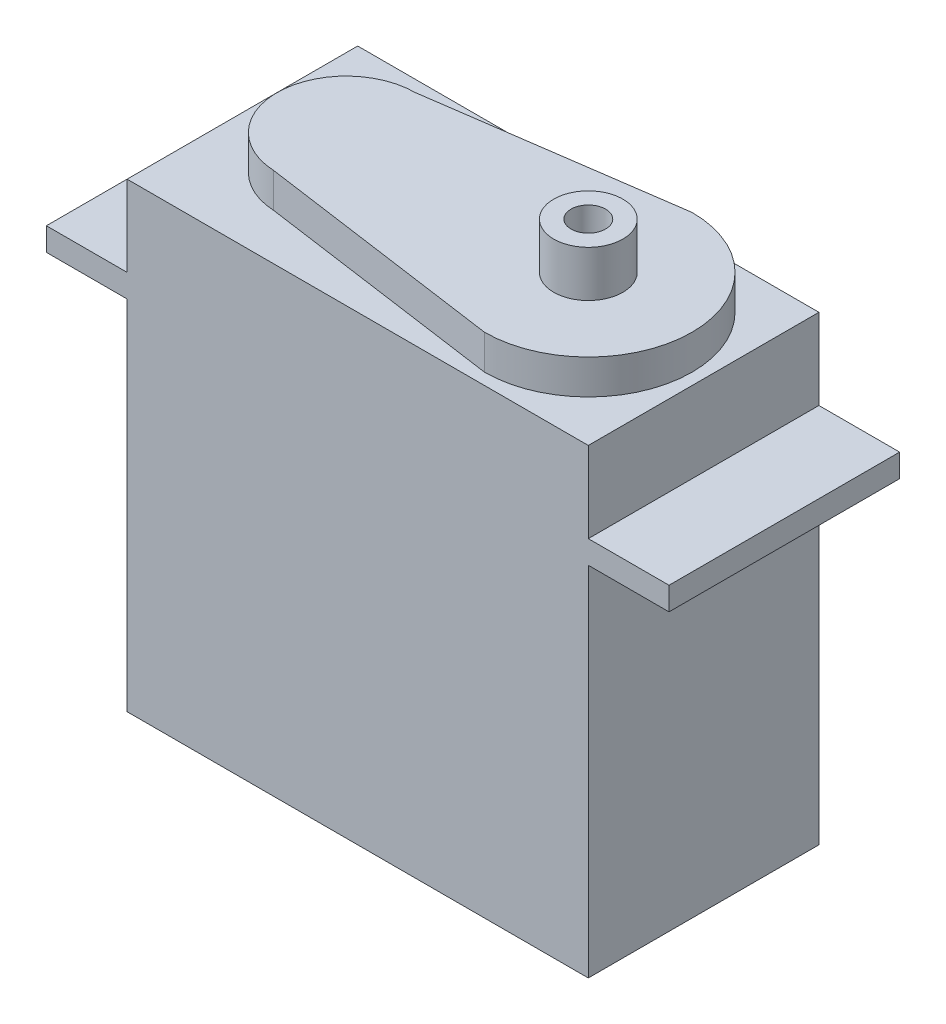
ISO-10303-21;
HEADER;
FILE_DESCRIPTION(('STEP AP214'),'2;1');
FILE_NAME('part.step','',(''),(''),'','','');
FILE_SCHEMA(('AUTOMOTIVE_DESIGN { 1 0 10303 214 1 1 1 1 }'));
ENDSEC;
DATA;
#1=APPLICATION_CONTEXT('core data for automotive mechanical design processes');
#2=APPLICATION_PROTOCOL_DEFINITION('international standard','automotive_design',2000,#1);
#3=PRODUCT_CONTEXT('',#1,'mechanical');
#4=PRODUCT('Part','Part','',(#3));
#5=PRODUCT_RELATED_PRODUCT_CATEGORY('part','',(#4));
#6=PRODUCT_DEFINITION_FORMATION('','',#4);
#7=PRODUCT_DEFINITION_CONTEXT('part definition',#1,'design');
#8=PRODUCT_DEFINITION('design','',#6,#7);
#9=PRODUCT_DEFINITION_SHAPE('','',#8);
#10=(LENGTH_UNIT() NAMED_UNIT(*) SI_UNIT(.MILLI.,.METRE.));
#11=(NAMED_UNIT(*) PLANE_ANGLE_UNIT() SI_UNIT($,.RADIAN.));
#12=(NAMED_UNIT(*) SI_UNIT($,.STERADIAN.) SOLID_ANGLE_UNIT());
#13=UNCERTAINTY_MEASURE_WITH_UNIT(LENGTH_MEASURE(1.E-05),#10,'distance_accuracy_value','');
#14=(GEOMETRIC_REPRESENTATION_CONTEXT(3) GLOBAL_UNCERTAINTY_ASSIGNED_CONTEXT((#13)) GLOBAL_UNIT_ASSIGNED_CONTEXT((#10,
#11,#12)) REPRESENTATION_CONTEXT('',''));
#15=CARTESIAN_POINT('',(0.,0.,0.));
#16=DIRECTION('',(0.,0.,1.));
#17=DIRECTION('',(1.,0.,0.));
#18=AXIS2_PLACEMENT_3D('',#15,#16,#17);
#19=CARTESIAN_POINT('',(-20.,20.,20.));
#20=DIRECTION('',(1.,0.,0.));
#21=DIRECTION('',(0.,1.,0.));
#22=AXIS2_PLACEMENT_3D('',#19,#20,#21);
#23=PLANE('',#22);
#24=DIRECTION('',(0.,0.,-1.));
#25=VECTOR('',#24,1.);
#26=CARTESIAN_POINT('',(-20.,13.,20.));
#27=LINE('',#26,#25);
#28=CARTESIAN_POINT('',(-20.,13.,20.));
#29=VERTEX_POINT('',#28);
#30=CARTESIAN_POINT('',(-20.,13.,0.));
#31=VERTEX_POINT('',#30);
#32=EDGE_CURVE('E267',#29,#31,#27,.T.);
#33=ORIENTED_EDGE('',*,*,#32,.F.);
#34=DIRECTION('',(0.,-1.,0.));
#35=VECTOR('',#34,1.);
#36=CARTESIAN_POINT('',(-20.,20.,20.));
#37=LINE('',#36,#35);
#38=CARTESIAN_POINT('',(-20.,20.,20.));
#39=VERTEX_POINT('',#38);
#40=EDGE_CURVE('E172',#39,#29,#37,.T.);
#41=ORIENTED_EDGE('',*,*,#40,.F.);
#42=DIRECTION('',(0.,0.,-1.));
#43=VECTOR('',#42,1.);
#44=CARTESIAN_POINT('',(-20.,20.,20.));
#45=LINE('',#44,#43);
#46=CARTESIAN_POINT('',(-20.,20.,0.));
#47=VERTEX_POINT('',#46);
#48=EDGE_CURVE('E204',#39,#47,#45,.T.);
#49=ORIENTED_EDGE('',*,*,#48,.T.);
#50=DIRECTION('',(0.,-1.,0.));
#51=VECTOR('',#50,1.);
#52=CARTESIAN_POINT('',(-20.,20.,0.));
#53=LINE('',#52,#51);
#54=EDGE_CURVE('E212',#47,#31,#53,.T.);
#55=ORIENTED_EDGE('',*,*,#54,.T.);
#56=EDGE_LOOP('',(#33,#41,#49,#55));
#57=FACE_BOUND('',#56,.T.);
#58=ADVANCED_FACE('F34',(#57),#23,.F.);
#59=CARTESIAN_POINT('',(20.,20.,20.));
#60=DIRECTION('',(-1.,0.,0.));
#61=DIRECTION('',(0.,-1.,0.));
#62=AXIS2_PLACEMENT_3D('',#59,#60,#61);
#63=PLANE('',#62);
#64=DIRECTION('',(0.,0.,-1.));
#65=VECTOR('',#64,1.);
#66=CARTESIAN_POINT('',(20.,11.,20.));
#67=LINE('',#66,#65);
#68=CARTESIAN_POINT('',(20.,11.,20.));
#69=VERTEX_POINT('',#68);
#70=CARTESIAN_POINT('',(20.,11.,0.));
#71=VERTEX_POINT('',#70);
#72=EDGE_CURVE('E232',#69,#71,#67,.T.);
#73=ORIENTED_EDGE('',*,*,#72,.F.);
#74=DIRECTION('',(0.,1.,0.));
#75=VECTOR('',#74,1.);
#76=CARTESIAN_POINT('',(20.,20.,20.));
#77=LINE('',#76,#75);
#78=CARTESIAN_POINT('',(20.,-20.,20.));
#79=VERTEX_POINT('',#78);
#80=EDGE_CURVE('E178',#79,#69,#77,.T.);
#81=ORIENTED_EDGE('',*,*,#80,.F.);
#82=DIRECTION('',(0.,0.,-1.));
#83=VECTOR('',#82,1.);
#84=CARTESIAN_POINT('',(20.,-20.,20.));
#85=LINE('',#84,#83);
#86=CARTESIAN_POINT('',(20.,-20.,0.));
#87=VERTEX_POINT('',#86);
#88=EDGE_CURVE('E189',#79,#87,#85,.T.);
#89=ORIENTED_EDGE('',*,*,#88,.T.);
#90=DIRECTION('',(0.,1.,0.));
#91=VECTOR('',#90,1.);
#92=CARTESIAN_POINT('',(20.,20.,0.));
#93=LINE('',#92,#91);
#94=EDGE_CURVE('E199',#87,#71,#93,.T.);
#95=ORIENTED_EDGE('',*,*,#94,.T.);
#96=EDGE_LOOP('',(#73,#81,#89,#95));
#97=FACE_BOUND('',#96,.T.);
#98=ADVANCED_FACE('F322',(#97),#63,.F.);
#99=CARTESIAN_POINT('',(9.99999999999999,23.,10.));
#100=DIRECTION('',(0.,1.,0.));
#101=DIRECTION('',(0.,0.,1.));
#102=AXIS2_PLACEMENT_3D('',#99,#100,#101);
#103=PLANE('',#102);
#104=CARTESIAN_POINT('',(9.99999999999999,23.,10.));
#105=DIRECTION('',(0.,1.,0.));
#106=DIRECTION('',(0.,0.,1.));
#107=AXIS2_PLACEMENT_3D('',#104,#105,#106);
#108=CIRCLE('',#107,9.);
#109=CARTESIAN_POINT('',(9.99999999999999,23.,19.));
#110=VERTEX_POINT('',#109);
#111=CARTESIAN_POINT('',(9.99999999999999,23.,1.));
#112=VERTEX_POINT('',#111);
#113=EDGE_CURVE('E407',#110,#112,#108,.T.);
#114=ORIENTED_EDGE('',*,*,#113,.T.);
#115=DIRECTION('',(-0.989949493661166,0.,0.141421356237309));
#116=VECTOR('',#115,1.);
#117=CARTESIAN_POINT('',(9.99999999999999,23.,1.));
#118=LINE('',#117,#116);
#119=CARTESIAN_POINT('',(-11.,23.,4.));
#120=VERTEX_POINT('',#119);
#121=EDGE_CURVE('E409',#112,#120,#118,.T.);
#122=ORIENTED_EDGE('',*,*,#121,.T.);
#123=CARTESIAN_POINT('',(-11.,23.,10.));
#124=DIRECTION('',(0.,1.,0.));
#125=DIRECTION('',(0.,0.,1.));
#126=AXIS2_PLACEMENT_3D('',#123,#124,#125);
#127=CIRCLE('',#126,6.);
#128=CARTESIAN_POINT('',(-11.2900500525208,23.,15.992985146572));
#129=VERTEX_POINT('',#128);
#130=EDGE_CURVE('E412',#120,#129,#127,.T.);
#131=ORIENTED_EDGE('',*,*,#130,.T.);
#132=DIRECTION('',(0.990172372254836,0.,0.139852326484868));
#133=VECTOR('',#132,1.);
#134=CARTESIAN_POINT('',(-11.2900500525208,23.,15.992985146572));
#135=LINE('',#134,#133);
#136=EDGE_CURVE('E414',#129,#110,#135,.T.);
#137=ORIENTED_EDGE('',*,*,#136,.T.);
#138=EDGE_LOOP('',(#114,#122,#131,#137));
#139=FACE_BOUND('',#138,.T.);
#140=CARTESIAN_POINT('',(9.99999999999999,23.,10.));
#141=DIRECTION('',(0.,1.,0.));
#142=DIRECTION('',(0.,0.,1.));
#143=AXIS2_PLACEMENT_3D('',#140,#141,#142);
#144=CIRCLE('',#143,3.);
#145=CARTESIAN_POINT('',(9.99999999999999,23.,13.));
#146=VERTEX_POINT('',#145);
#147=EDGE_CURVE('E400',#146,#146,#144,.T.);
#148=ORIENTED_EDGE('',*,*,#147,.F.);
#149=EDGE_LOOP('',(#148));
#150=FACE_BOUND('',#149,.T.);
#151=ADVANCED_FACE('F344',(#139,#150),#103,.T.);
#152=CARTESIAN_POINT('',(-20.,20.,20.));
#153=DIRECTION('',(0.,-1.,0.));
#154=DIRECTION('',(0.,0.,-1.));
#155=AXIS2_PLACEMENT_3D('',#152,#153,#154);
#156=PLANE('',#155);
#157=DIRECTION('',(-1.,0.,0.));
#158=VECTOR('',#157,1.);
#159=CARTESIAN_POINT('',(-20.,20.,0.));
#160=LINE('',#159,#158);
#161=CARTESIAN_POINT('',(20.,20.,0.));
#162=VERTEX_POINT('',#161);
#163=EDGE_CURVE('E192',#162,#47,#160,.T.);
#164=ORIENTED_EDGE('',*,*,#163,.T.);
#165=ORIENTED_EDGE('',*,*,#48,.F.);
#166=DIRECTION('',(-1.,0.,0.));
#167=VECTOR('',#166,1.);
#168=CARTESIAN_POINT('',(-20.,20.,20.));
#169=LINE('',#168,#167);
#170=CARTESIAN_POINT('',(20.,20.,20.));
#171=VERTEX_POINT('',#170);
#172=EDGE_CURVE('E173',#171,#39,#169,.T.);
#173=ORIENTED_EDGE('',*,*,#172,.F.);
#174=DIRECTION('',(0.,0.,-1.));
#175=VECTOR('',#174,1.);
#176=CARTESIAN_POINT('',(20.,20.,20.));
#177=LINE('',#176,#175);
#178=EDGE_CURVE('E43',#171,#162,#177,.T.);
#179=ORIENTED_EDGE('',*,*,#178,.T.);
#180=EDGE_LOOP('',(#164,#165,#173,#179));
#181=FACE_BOUND('',#180,.T.);
#182=CARTESIAN_POINT('',(9.99999999999999,20.,10.));
#183=DIRECTION('',(0.,1.,0.));
#184=DIRECTION('',(0.,0.,1.));
#185=AXIS2_PLACEMENT_3D('',#182,#183,#184);
#186=CIRCLE('',#185,9.);
#187=CARTESIAN_POINT('',(9.99999999999999,20.,19.));
#188=VERTEX_POINT('',#187);
#189=CARTESIAN_POINT('',(9.99999999999999,20.,1.));
#190=VERTEX_POINT('',#189);
#191=EDGE_CURVE('E405',#188,#190,#186,.T.);
#192=ORIENTED_EDGE('',*,*,#191,.F.);
#193=DIRECTION('',(0.990172372254836,0.,0.139852326484868));
#194=VECTOR('',#193,1.);
#195=CARTESIAN_POINT('',(-11.2900500525208,20.,15.992985146572));
#196=LINE('',#195,#194);
#197=CARTESIAN_POINT('',(-11.2900500525208,20.,15.992985146572));
#198=VERTEX_POINT('',#197);
#199=EDGE_CURVE('E410',#198,#188,#196,.T.);
#200=ORIENTED_EDGE('',*,*,#199,.F.);
#201=CARTESIAN_POINT('',(-11.,20.,10.));
#202=DIRECTION('',(0.,1.,0.));
#203=DIRECTION('',(0.,0.,1.));
#204=AXIS2_PLACEMENT_3D('',#201,#202,#203);
#205=CIRCLE('',#204,6.);
#206=CARTESIAN_POINT('',(-11.,20.,4.));
#207=VERTEX_POINT('',#206);
#208=EDGE_CURVE('E420',#207,#198,#205,.T.);
#209=ORIENTED_EDGE('',*,*,#208,.F.);
#210=DIRECTION('',(-0.989949493661166,0.,0.141421356237309));
#211=VECTOR('',#210,1.);
#212=CARTESIAN_POINT('',(9.99999999999999,20.,1.));
#213=LINE('',#212,#211);
#214=EDGE_CURVE('E418',#190,#207,#213,.T.);
#215=ORIENTED_EDGE('',*,*,#214,.F.);
#216=EDGE_LOOP('',(#192,#200,#209,#215));
#217=FACE_BOUND('',#216,.T.);
#218=ADVANCED_FACE('F289',(#181,#217),#156,.F.);
#219=CARTESIAN_POINT('',(20.,13.,20.));
#220=VERTEX_POINT('',#219);
#221=EDGE_CURVE('E211',#220,#171,#77,.T.);
#222=ORIENTED_EDGE('',*,*,#221,.F.);
#223=DIRECTION('',(0.,0.,-1.));
#224=VECTOR('',#223,1.);
#225=CARTESIAN_POINT('',(20.,13.,20.));
#226=LINE('',#225,#224);
#227=CARTESIAN_POINT('',(20.,13.,0.));
#228=VERTEX_POINT('',#227);
#229=EDGE_CURVE('E230',#220,#228,#226,.T.);
#230=ORIENTED_EDGE('',*,*,#229,.T.);
#231=EDGE_CURVE('E196',#228,#162,#93,.T.);
#232=ORIENTED_EDGE('',*,*,#231,.T.);
#233=ORIENTED_EDGE('',*,*,#178,.F.);
#234=EDGE_LOOP('',(#222,#230,#232,#233));
#235=FACE_BOUND('',#234,.T.);
#236=ADVANCED_FACE('F36',(#235),#63,.F.);
#237=CARTESIAN_POINT('',(-20.,11.,20.));
#238=VERTEX_POINT('',#237);
#239=CARTESIAN_POINT('',(-20.,-20.,20.));
#240=VERTEX_POINT('',#239);
#241=EDGE_CURVE('E161',#238,#240,#37,.T.);
#242=ORIENTED_EDGE('',*,*,#241,.F.);
#243=DIRECTION('',(0.,0.,-1.));
#244=VECTOR('',#243,1.);
#245=CARTESIAN_POINT('',(-20.,11.,20.));
#246=LINE('',#245,#244);
#247=CARTESIAN_POINT('',(-20.,11.,0.));
#248=VERTEX_POINT('',#247);
#249=EDGE_CURVE('E147',#238,#248,#246,.T.);
#250=ORIENTED_EDGE('',*,*,#249,.T.);
#251=CARTESIAN_POINT('',(-20.,-20.,0.));
#252=VERTEX_POINT('',#251);
#253=EDGE_CURVE('E215',#248,#252,#53,.T.);
#254=ORIENTED_EDGE('',*,*,#253,.T.);
#255=DIRECTION('',(0.,0.,-1.));
#256=VECTOR('',#255,1.);
#257=CARTESIAN_POINT('',(-20.,-20.,20.));
#258=LINE('',#257,#256);
#259=EDGE_CURVE('E170',#240,#252,#258,.T.);
#260=ORIENTED_EDGE('',*,*,#259,.F.);
#261=EDGE_LOOP('',(#242,#250,#254,#260));
#262=FACE_BOUND('',#261,.T.);
#263=ADVANCED_FACE('F168',(#262),#23,.F.);
#264=CARTESIAN_POINT('',(-20.,-20.,20.));
#265=DIRECTION('',(0.,1.,0.));
#266=DIRECTION('',(0.,0.,1.));
#267=AXIS2_PLACEMENT_3D('',#264,#265,#266);
#268=PLANE('',#267);
#269=DIRECTION('',(1.,0.,0.));
#270=VECTOR('',#269,1.);
#271=CARTESIAN_POINT('',(-20.,-20.,0.));
#272=LINE('',#271,#270);
#273=EDGE_CURVE('E210',#252,#87,#272,.T.);
#274=ORIENTED_EDGE('',*,*,#273,.T.);
#275=ORIENTED_EDGE('',*,*,#88,.F.);
#276=DIRECTION('',(1.,0.,0.));
#277=VECTOR('',#276,1.);
#278=CARTESIAN_POINT('',(-20.,-20.,20.));
#279=LINE('',#278,#277);
#280=EDGE_CURVE('E176',#240,#79,#279,.T.);
#281=ORIENTED_EDGE('',*,*,#280,.F.);
#282=ORIENTED_EDGE('',*,*,#259,.T.);
#283=EDGE_LOOP('',(#274,#275,#281,#282));
#284=FACE_BOUND('',#283,.T.);
#285=ADVANCED_FACE('F347',(#284),#268,.F.);
#286=CARTESIAN_POINT('',(0.,0.,20.));
#287=DIRECTION('',(0.,0.,1.));
#288=DIRECTION('',(1.,0.,0.));
#289=AXIS2_PLACEMENT_3D('',#286,#287,#288);
#290=PLANE('',#289);
#291=ORIENTED_EDGE('',*,*,#80,.T.);
#292=DIRECTION('',(-1.,0.,0.));
#293=VECTOR('',#292,1.);
#294=CARTESIAN_POINT('',(20.,11.,20.));
#295=LINE('',#294,#293);
#296=CARTESIAN_POINT('',(27.,11.,20.));
#297=VERTEX_POINT('',#296);
#298=EDGE_CURVE('E228',#297,#69,#295,.T.);
#299=ORIENTED_EDGE('',*,*,#298,.F.);
#300=DIRECTION('',(0.,-1.,0.));
#301=VECTOR('',#300,1.);
#302=CARTESIAN_POINT('',(27.,13.,20.));
#303=LINE('',#302,#301);
#304=CARTESIAN_POINT('',(27.,13.,20.));
#305=VERTEX_POINT('',#304);
#306=EDGE_CURVE('E231',#305,#297,#303,.T.);
#307=ORIENTED_EDGE('',*,*,#306,.F.);
#308=DIRECTION('',(1.,0.,0.));
#309=VECTOR('',#308,1.);
#310=CARTESIAN_POINT('',(20.,13.,20.));
#311=LINE('',#310,#309);
#312=EDGE_CURVE('E224',#220,#305,#311,.T.);
#313=ORIENTED_EDGE('',*,*,#312,.F.);
#314=ORIENTED_EDGE('',*,*,#221,.T.);
#315=ORIENTED_EDGE('',*,*,#172,.T.);
#316=ORIENTED_EDGE('',*,*,#40,.T.);
#317=DIRECTION('',(1.,0.,0.));
#318=VECTOR('',#317,1.);
#319=CARTESIAN_POINT('',(-20.,13.,20.));
#320=LINE('',#319,#318);
#321=CARTESIAN_POINT('',(-27.,13.,20.));
#322=VERTEX_POINT('',#321);
#323=EDGE_CURVE('E155',#322,#29,#320,.T.);
#324=ORIENTED_EDGE('',*,*,#323,.F.);
#325=DIRECTION('',(0.,1.,0.));
#326=VECTOR('',#325,1.);
#327=CARTESIAN_POINT('',(-27.,13.,20.));
#328=LINE('',#327,#326);
#329=CARTESIAN_POINT('',(-27.,11.,20.));
#330=VERTEX_POINT('',#329);
#331=EDGE_CURVE('E165',#330,#322,#328,.T.);
#332=ORIENTED_EDGE('',*,*,#331,.F.);
#333=DIRECTION('',(-1.,0.,0.));
#334=VECTOR('',#333,1.);
#335=CARTESIAN_POINT('',(-20.,11.,20.));
#336=LINE('',#335,#334);
#337=EDGE_CURVE('E150',#238,#330,#336,.T.);
#338=ORIENTED_EDGE('',*,*,#337,.F.);
#339=ORIENTED_EDGE('',*,*,#241,.T.);
#340=ORIENTED_EDGE('',*,*,#280,.T.);
#341=EDGE_LOOP('',(#291,#299,#307,#313,#314,#315,#316,#324,#332,#338,#339,#340));
#342=FACE_BOUND('',#341,.T.);
#343=ADVANCED_FACE('F160',(#342),#290,.T.);
#344=CARTESIAN_POINT('',(0.,0.,0.));
#345=DIRECTION('',(0.,0.,1.));
#346=DIRECTION('',(1.,0.,0.));
#347=AXIS2_PLACEMENT_3D('',#344,#345,#346);
#348=PLANE('',#347);
#349=ORIENTED_EDGE('',*,*,#94,.F.);
#350=ORIENTED_EDGE('',*,*,#273,.F.);
#351=ORIENTED_EDGE('',*,*,#253,.F.);
#352=DIRECTION('',(-1.,0.,0.));
#353=VECTOR('',#352,1.);
#354=CARTESIAN_POINT('',(-20.,11.,0.));
#355=LINE('',#354,#353);
#356=CARTESIAN_POINT('',(-27.,11.,0.));
#357=VERTEX_POINT('',#356);
#358=EDGE_CURVE('E51',#248,#357,#355,.T.);
#359=ORIENTED_EDGE('',*,*,#358,.T.);
#360=DIRECTION('',(0.,1.,0.));
#361=VECTOR('',#360,1.);
#362=CARTESIAN_POINT('',(-27.,13.,0.));
#363=LINE('',#362,#361);
#364=CARTESIAN_POINT('',(-27.,13.,0.));
#365=VERTEX_POINT('',#364);
#366=EDGE_CURVE('E274',#357,#365,#363,.T.);
#367=ORIENTED_EDGE('',*,*,#366,.T.);
#368=DIRECTION('',(1.,0.,0.));
#369=VECTOR('',#368,1.);
#370=CARTESIAN_POINT('',(-20.,13.,0.));
#371=LINE('',#370,#369);
#372=EDGE_CURVE('E166',#365,#31,#371,.T.);
#373=ORIENTED_EDGE('',*,*,#372,.T.);
#374=ORIENTED_EDGE('',*,*,#54,.F.);
#375=ORIENTED_EDGE('',*,*,#163,.F.);
#376=ORIENTED_EDGE('',*,*,#231,.F.);
#377=DIRECTION('',(1.,0.,0.));
#378=VECTOR('',#377,1.);
#379=CARTESIAN_POINT('',(20.,13.,0.));
#380=LINE('',#379,#378);
#381=CARTESIAN_POINT('',(27.,13.,0.));
#382=VERTEX_POINT('',#381);
#383=EDGE_CURVE('E59',#228,#382,#380,.T.);
#384=ORIENTED_EDGE('',*,*,#383,.T.);
#385=DIRECTION('',(0.,-1.,0.));
#386=VECTOR('',#385,1.);
#387=CARTESIAN_POINT('',(27.,13.,0.));
#388=LINE('',#387,#386);
#389=CARTESIAN_POINT('',(27.,11.,0.));
#390=VERTEX_POINT('',#389);
#391=EDGE_CURVE('E225',#382,#390,#388,.T.);
#392=ORIENTED_EDGE('',*,*,#391,.T.);
#393=DIRECTION('',(-1.,0.,0.));
#394=VECTOR('',#393,1.);
#395=CARTESIAN_POINT('',(20.,11.,0.));
#396=LINE('',#395,#394);
#397=EDGE_CURVE('E221',#390,#71,#396,.T.);
#398=ORIENTED_EDGE('',*,*,#397,.T.);
#399=EDGE_LOOP('',(#349,#350,#351,#359,#367,#373,#374,#375,#376,#384,#392,#398));
#400=FACE_BOUND('',#399,.T.);
#401=ADVANCED_FACE('F284',(#400),#348,.F.);
#402=CARTESIAN_POINT('',(9.99999999999999,23.,10.));
#403=DIRECTION('',(0.,-1.,0.));
#404=DIRECTION('',(0.,0.,-1.));
#405=AXIS2_PLACEMENT_3D('',#402,#403,#404);
#406=CYLINDRICAL_SURFACE('',#405,9.);
#407=ORIENTED_EDGE('',*,*,#191,.T.);
#408=DIRECTION('',(0.,-1.,0.));
#409=VECTOR('',#408,1.);
#410=CARTESIAN_POINT('',(9.99999999999999,23.,1.));
#411=LINE('',#410,#409);
#412=EDGE_CURVE('E303',#112,#190,#411,.T.);
#413=ORIENTED_EDGE('',*,*,#412,.F.);
#414=ORIENTED_EDGE('',*,*,#113,.F.);
#415=DIRECTION('',(0.,-1.,0.));
#416=VECTOR('',#415,1.);
#417=CARTESIAN_POINT('',(9.99999999999999,23.,19.));
#418=LINE('',#417,#416);
#419=EDGE_CURVE('E416',#110,#188,#418,.T.);
#420=ORIENTED_EDGE('',*,*,#419,.T.);
#421=EDGE_LOOP('',(#407,#413,#414,#420));
#422=FACE_BOUND('',#421,.T.);
#423=ADVANCED_FACE('F436',(#422),#406,.T.);
#424=CARTESIAN_POINT('',(9.99999999999999,23.,1.));
#425=DIRECTION('',(0.141421356237309,0.,0.989949493661167));
#426=DIRECTION('',(0.989949493661167,0.,-0.141421356237309));
#427=AXIS2_PLACEMENT_3D('',#424,#425,#426);
#428=PLANE('',#427);
#429=ORIENTED_EDGE('',*,*,#214,.T.);
#430=DIRECTION('',(0.,-1.,0.));
#431=VECTOR('',#430,1.);
#432=CARTESIAN_POINT('',(-11.,23.,4.));
#433=LINE('',#432,#431);
#434=EDGE_CURVE('E305',#120,#207,#433,.T.);
#435=ORIENTED_EDGE('',*,*,#434,.F.);
#436=ORIENTED_EDGE('',*,*,#121,.F.);
#437=ORIENTED_EDGE('',*,*,#412,.T.);
#438=EDGE_LOOP('',(#429,#435,#436,#437));
#439=FACE_BOUND('',#438,.T.);
#440=ADVANCED_FACE('F433',(#439),#428,.F.);
#441=CARTESIAN_POINT('',(-11.,23.,10.));
#442=DIRECTION('',(0.,-1.,0.));
#443=DIRECTION('',(0.,0.,-1.));
#444=AXIS2_PLACEMENT_3D('',#441,#442,#443);
#445=CYLINDRICAL_SURFACE('',#444,6.);
#446=ORIENTED_EDGE('',*,*,#208,.T.);
#447=DIRECTION('',(0.,-1.,0.));
#448=VECTOR('',#447,1.);
#449=CARTESIAN_POINT('',(-11.2900500525208,23.,15.992985146572));
#450=LINE('',#449,#448);
#451=EDGE_CURVE('E312',#129,#198,#450,.T.);
#452=ORIENTED_EDGE('',*,*,#451,.F.);
#453=ORIENTED_EDGE('',*,*,#130,.F.);
#454=ORIENTED_EDGE('',*,*,#434,.T.);
#455=EDGE_LOOP('',(#446,#452,#453,#454));
#456=FACE_BOUND('',#455,.T.);
#457=ADVANCED_FACE('F393',(#456),#445,.T.);
#458=CARTESIAN_POINT('',(-11.2900500525208,23.,15.992985146572));
#459=DIRECTION('',(0.139852326484868,0.,-0.990172372254836));
#460=DIRECTION('',(-0.990172372254836,0.,-0.139852326484868));
#461=AXIS2_PLACEMENT_3D('',#458,#459,#460);
#462=PLANE('',#461);
#463=ORIENTED_EDGE('',*,*,#199,.T.);
#464=ORIENTED_EDGE('',*,*,#419,.F.);
#465=ORIENTED_EDGE('',*,*,#136,.F.);
#466=ORIENTED_EDGE('',*,*,#451,.T.);
#467=EDGE_LOOP('',(#463,#464,#465,#466));
#468=FACE_BOUND('',#467,.T.);
#469=ADVANCED_FACE('F388',(#468),#462,.F.);
#470=CARTESIAN_POINT('',(9.99999999999999,27.,10.));
#471=DIRECTION('',(0.,1.,0.));
#472=DIRECTION('',(0.,0.,1.));
#473=AXIS2_PLACEMENT_3D('',#470,#471,#472);
#474=PLANE('',#473);
#475=CARTESIAN_POINT('',(9.99999999999999,27.,10.));
#476=DIRECTION('',(0.,1.,0.));
#477=DIRECTION('',(0.,0.,1.));
#478=AXIS2_PLACEMENT_3D('',#475,#476,#477);
#479=CIRCLE('',#478,3.);
#480=CARTESIAN_POINT('',(9.99999999999999,27.,13.));
#481=VERTEX_POINT('',#480);
#482=EDGE_CURVE('E398',#481,#481,#479,.T.);
#483=ORIENTED_EDGE('',*,*,#482,.T.);
#484=EDGE_LOOP('',(#483));
#485=FACE_BOUND('',#484,.T.);
#486=CARTESIAN_POINT('',(9.99999999999999,27.,10.));
#487=DIRECTION('',(0.,1.,0.));
#488=DIRECTION('',(0.,0.,1.));
#489=AXIS2_PLACEMENT_3D('',#486,#487,#488);
#490=CIRCLE('',#489,1.5);
#491=CARTESIAN_POINT('',(9.99999999999999,27.,11.5));
#492=VERTEX_POINT('',#491);
#493=EDGE_CURVE('E235',#492,#492,#490,.T.);
#494=ORIENTED_EDGE('',*,*,#493,.F.);
#495=EDGE_LOOP('',(#494));
#496=FACE_BOUND('',#495,.T.);
#497=ADVANCED_FACE('F383',(#485,#496),#474,.T.);
#498=CARTESIAN_POINT('',(9.99999999999999,27.,10.));
#499=DIRECTION('',(0.,-1.,0.));
#500=DIRECTION('',(0.,0.,-1.));
#501=AXIS2_PLACEMENT_3D('',#498,#499,#500);
#502=CYLINDRICAL_SURFACE('',#501,3.);
#503=ORIENTED_EDGE('',*,*,#482,.F.);
#504=EDGE_LOOP('',(#503));
#505=FACE_BOUND('',#504,.T.);
#506=ORIENTED_EDGE('',*,*,#147,.T.);
#507=EDGE_LOOP('',(#506));
#508=FACE_BOUND('',#507,.T.);
#509=ADVANCED_FACE('F376',(#505,#508),#502,.T.);
#510=CARTESIAN_POINT('',(9.99999999999999,27.,10.));
#511=DIRECTION('',(0.,-1.,0.));
#512=DIRECTION('',(0.,0.,-1.));
#513=AXIS2_PLACEMENT_3D('',#510,#511,#512);
#514=CYLINDRICAL_SURFACE('',#513,1.5);
#515=ORIENTED_EDGE('',*,*,#493,.T.);
#516=EDGE_LOOP('',(#515));
#517=FACE_BOUND('',#516,.T.);
#518=CARTESIAN_POINT('',(9.99999999999999,23.,10.));
#519=DIRECTION('',(0.,1.,0.));
#520=DIRECTION('',(0.,0.,1.));
#521=AXIS2_PLACEMENT_3D('',#518,#519,#520);
#522=CIRCLE('',#521,1.5);
#523=CARTESIAN_POINT('',(9.99999999999999,23.,11.5));
#524=VERTEX_POINT('',#523);
#525=EDGE_CURVE('E11',#524,#524,#522,.F.);
#526=ORIENTED_EDGE('',*,*,#525,.T.);
#527=EDGE_LOOP('',(#526));
#528=FACE_BOUND('',#527,.T.);
#529=ADVANCED_FACE('F369',(#517,#528),#514,.F.);
#530=ORIENTED_EDGE('',*,*,#525,.F.);
#531=EDGE_LOOP('',(#530));
#532=FACE_BOUND('',#531,.T.);
#533=ADVANCED_FACE('F361',(#532),#103,.T.);
#534=CARTESIAN_POINT('',(20.,11.,20.));
#535=DIRECTION('',(0.,-1.,0.));
#536=DIRECTION('',(1.,0.,0.));
#537=AXIS2_PLACEMENT_3D('',#534,#535,#536);
#538=PLANE('',#537);
#539=ORIENTED_EDGE('',*,*,#397,.F.);
#540=DIRECTION('',(0.,0.,-1.));
#541=VECTOR('',#540,1.);
#542=CARTESIAN_POINT('',(27.,11.,20.));
#543=LINE('',#542,#541);
#544=EDGE_CURVE('E236',#297,#390,#543,.T.);
#545=ORIENTED_EDGE('',*,*,#544,.F.);
#546=ORIENTED_EDGE('',*,*,#298,.T.);
#547=ORIENTED_EDGE('',*,*,#72,.T.);
#548=EDGE_LOOP('',(#539,#545,#546,#547));
#549=FACE_BOUND('',#548,.T.);
#550=ADVANCED_FACE('F325',(#549),#538,.T.);
#551=CARTESIAN_POINT('',(27.,13.,20.));
#552=DIRECTION('',(1.,0.,0.));
#553=DIRECTION('',(0.,0.,-1.));
#554=AXIS2_PLACEMENT_3D('',#551,#552,#553);
#555=PLANE('',#554);
#556=ORIENTED_EDGE('',*,*,#391,.F.);
#557=DIRECTION('',(0.,0.,-1.));
#558=VECTOR('',#557,1.);
#559=CARTESIAN_POINT('',(27.,13.,20.));
#560=LINE('',#559,#558);
#561=EDGE_CURVE('E244',#305,#382,#560,.T.);
#562=ORIENTED_EDGE('',*,*,#561,.F.);
#563=ORIENTED_EDGE('',*,*,#306,.T.);
#564=ORIENTED_EDGE('',*,*,#544,.T.);
#565=EDGE_LOOP('',(#556,#562,#563,#564));
#566=FACE_BOUND('',#565,.T.);
#567=ADVANCED_FACE('F328',(#566),#555,.T.);
#568=CARTESIAN_POINT('',(20.,13.,20.));
#569=DIRECTION('',(0.,1.,0.));
#570=DIRECTION('',(-1.,0.,0.));
#571=AXIS2_PLACEMENT_3D('',#568,#569,#570);
#572=PLANE('',#571);
#573=ORIENTED_EDGE('',*,*,#383,.F.);
#574=ORIENTED_EDGE('',*,*,#229,.F.);
#575=ORIENTED_EDGE('',*,*,#312,.T.);
#576=ORIENTED_EDGE('',*,*,#561,.T.);
#577=EDGE_LOOP('',(#573,#574,#575,#576));
#578=FACE_BOUND('',#577,.T.);
#579=ADVANCED_FACE('F329',(#578),#572,.T.);
#580=CARTESIAN_POINT('',(-20.,13.,20.));
#581=DIRECTION('',(0.,1.,0.));
#582=DIRECTION('',(0.,0.,1.));
#583=AXIS2_PLACEMENT_3D('',#580,#581,#582);
#584=PLANE('',#583);
#585=ORIENTED_EDGE('',*,*,#372,.F.);
#586=DIRECTION('',(0.,0.,-1.));
#587=VECTOR('',#586,1.);
#588=CARTESIAN_POINT('',(-27.,13.,20.));
#589=LINE('',#588,#587);
#590=EDGE_CURVE('E270',#322,#365,#589,.T.);
#591=ORIENTED_EDGE('',*,*,#590,.F.);
#592=ORIENTED_EDGE('',*,*,#323,.T.);
#593=ORIENTED_EDGE('',*,*,#32,.T.);
#594=EDGE_LOOP('',(#585,#591,#592,#593));
#595=FACE_BOUND('',#594,.T.);
#596=ADVANCED_FACE('F300',(#595),#584,.T.);
#597=CARTESIAN_POINT('',(-27.,13.,20.));
#598=DIRECTION('',(-1.,0.,0.));
#599=DIRECTION('',(0.,0.,1.));
#600=AXIS2_PLACEMENT_3D('',#597,#598,#599);
#601=PLANE('',#600);
#602=ORIENTED_EDGE('',*,*,#366,.F.);
#603=DIRECTION('',(0.,0.,-1.));
#604=VECTOR('',#603,1.);
#605=CARTESIAN_POINT('',(-27.,11.,20.));
#606=LINE('',#605,#604);
#607=EDGE_CURVE('E154',#330,#357,#606,.T.);
#608=ORIENTED_EDGE('',*,*,#607,.F.);
#609=ORIENTED_EDGE('',*,*,#331,.T.);
#610=ORIENTED_EDGE('',*,*,#590,.T.);
#611=EDGE_LOOP('',(#602,#608,#609,#610));
#612=FACE_BOUND('',#611,.T.);
#613=ADVANCED_FACE('F279',(#612),#601,.T.);
#614=CARTESIAN_POINT('',(-20.,11.,20.));
#615=DIRECTION('',(0.,-1.,0.));
#616=DIRECTION('',(0.,0.,-1.));
#617=AXIS2_PLACEMENT_3D('',#614,#615,#616);
#618=PLANE('',#617);
#619=ORIENTED_EDGE('',*,*,#358,.F.);
#620=ORIENTED_EDGE('',*,*,#249,.F.);
#621=ORIENTED_EDGE('',*,*,#337,.T.);
#622=ORIENTED_EDGE('',*,*,#607,.T.);
#623=EDGE_LOOP('',(#619,#620,#621,#622));
#624=FACE_BOUND('',#623,.T.);
#625=ADVANCED_FACE('F149',(#624),#618,.T.);
#626=CLOSED_SHELL('',(#58,#98,#151,#218,#236,#263,#285,#343,#401,#423,#440,#457,#469,#497,#509,
#529,#533,#550,#567,#579,#596,#613,#625));
#627=MANIFOLD_SOLID_BREP('B2',#626);
#628=ADVANCED_BREP_SHAPE_REPRESENTATION('',(#18,#627),#14);
#629=SHAPE_DEFINITION_REPRESENTATION(#9,#628);
ENDSEC;
END-ISO-10303-21;
